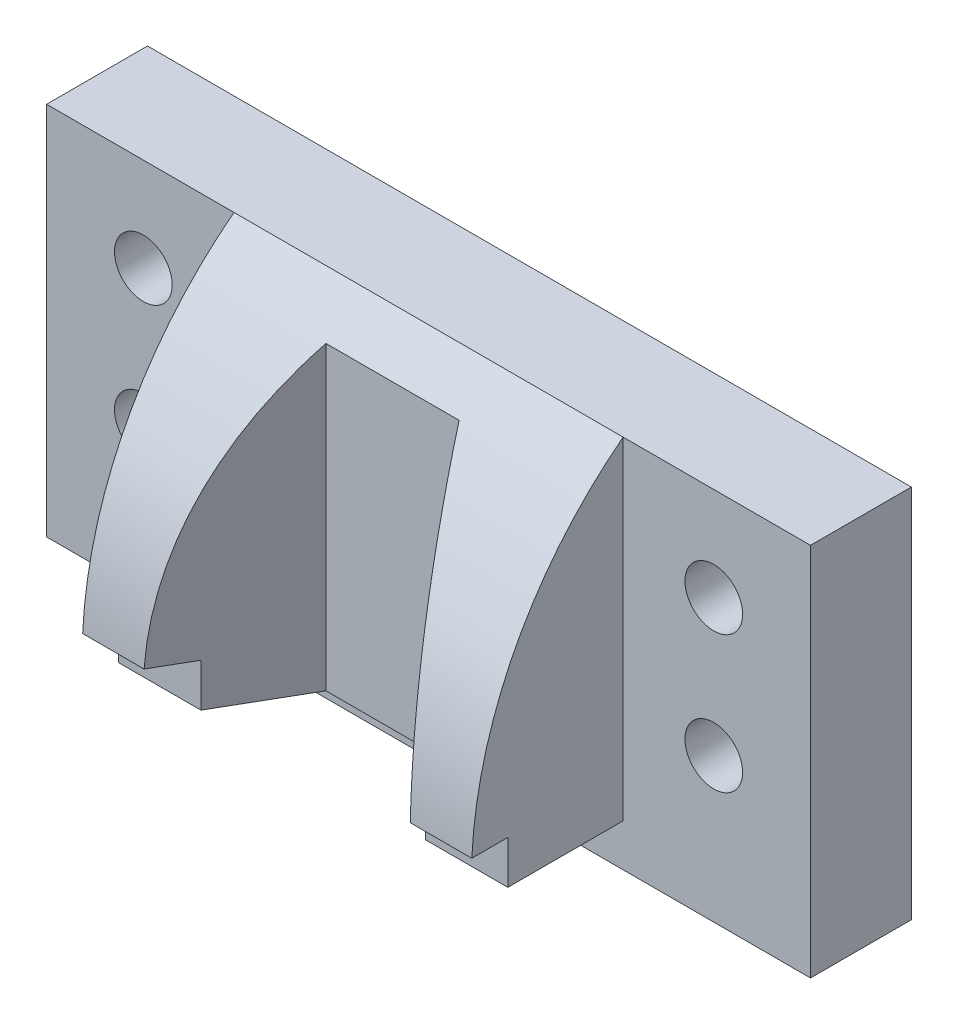
ISO-10303-21;
HEADER;
FILE_DESCRIPTION(('STEP AP214'),'2;1');
FILE_NAME('part.step','',(''),(''),'','','');
FILE_SCHEMA(('AUTOMOTIVE_DESIGN { 1 0 10303 214 1 1 1 1 }'));
ENDSEC;
DATA;
#1=APPLICATION_CONTEXT('core data for automotive mechanical design processes');
#2=APPLICATION_PROTOCOL_DEFINITION('international standard','automotive_design',2000,#1);
#3=PRODUCT_CONTEXT('',#1,'mechanical');
#4=PRODUCT('Part','Part','',(#3));
#5=PRODUCT_RELATED_PRODUCT_CATEGORY('part','',(#4));
#6=PRODUCT_DEFINITION_FORMATION('','',#4);
#7=PRODUCT_DEFINITION_CONTEXT('part definition',#1,'design');
#8=PRODUCT_DEFINITION('design','',#6,#7);
#9=PRODUCT_DEFINITION_SHAPE('','',#8);
#10=(LENGTH_UNIT() NAMED_UNIT(*) SI_UNIT(.MILLI.,.METRE.));
#11=(NAMED_UNIT(*) PLANE_ANGLE_UNIT() SI_UNIT($,.RADIAN.));
#12=(NAMED_UNIT(*) SI_UNIT($,.STERADIAN.) SOLID_ANGLE_UNIT());
#13=UNCERTAINTY_MEASURE_WITH_UNIT(LENGTH_MEASURE(1.E-05),#10,'distance_accuracy_value','');
#14=(GEOMETRIC_REPRESENTATION_CONTEXT(3) GLOBAL_UNCERTAINTY_ASSIGNED_CONTEXT((#13)) GLOBAL_UNIT_ASSIGNED_CONTEXT((#10,
#11,#12)) REPRESENTATION_CONTEXT('',''));
#15=CARTESIAN_POINT('',(0.,0.,0.));
#16=DIRECTION('',(0.,0.,1.));
#17=DIRECTION('',(1.,0.,0.));
#18=AXIS2_PLACEMENT_3D('',#15,#16,#17);
#19=CARTESIAN_POINT('',(-27.,-20.1088526123672,30.));
#20=DIRECTION('',(0.,0.,-1.));
#21=DIRECTION('',(-1.,0.,0.));
#22=AXIS2_PLACEMENT_3D('',#19,#20,#21);
#23=PLANE('',#22);
#24=DIRECTION('',(1.,0.,0.));
#25=VECTOR('',#24,1.);
#26=CARTESIAN_POINT('',(-27.,-20.1088526123672,30.));
#27=LINE('',#26,#25);
#28=CARTESIAN_POINT('',(-27.,-20.1088526123672,30.));
#29=VERTEX_POINT('',#28);
#30=CARTESIAN_POINT('',(-15.5884572681199,-20.1088526123672,30.));
#31=VERTEX_POINT('',#30);
#32=EDGE_CURVE('E236',#29,#31,#27,.T.);
#33=ORIENTED_EDGE('',*,*,#32,.T.);
#34=DIRECTION('',(0.,1.,0.));
#35=VECTOR('',#34,1.);
#36=CARTESIAN_POINT('',(-15.5884572681199,-20.1088526123672,30.));
#37=LINE('',#36,#35);
#38=CARTESIAN_POINT('',(-15.5884572681199,-14.1088526123672,30.));
#39=VERTEX_POINT('',#38);
#40=EDGE_CURVE('E181',#31,#39,#37,.T.);
#41=ORIENTED_EDGE('',*,*,#40,.T.);
#42=DIRECTION('',(1.,0.,0.));
#43=VECTOR('',#42,1.);
#44=CARTESIAN_POINT('',(-27.,-14.1088526123672,30.));
#45=LINE('',#44,#43);
#46=CARTESIAN_POINT('',(-27.,-14.1088526123672,30.));
#47=VERTEX_POINT('',#46);
#48=EDGE_CURVE('E232',#47,#39,#45,.T.);
#49=ORIENTED_EDGE('',*,*,#48,.F.);
#50=DIRECTION('',(0.,1.,0.));
#51=VECTOR('',#50,1.);
#52=CARTESIAN_POINT('',(-27.,-20.1088526123672,30.));
#53=LINE('',#52,#51);
#54=EDGE_CURVE('E205',#29,#47,#53,.T.);
#55=ORIENTED_EDGE('',*,*,#54,.F.);
#56=EDGE_LOOP('',(#33,#41,#49,#55));
#57=FACE_BOUND('',#56,.T.);
#58=ADVANCED_FACE('F43',(#57),#23,.F.);
#59=CARTESIAN_POINT('',(-27.,-14.1088526123672,30.));
#60=DIRECTION('',(0.,1.,0.));
#61=DIRECTION('',(-1.,0.,0.));
#62=AXIS2_PLACEMENT_3D('',#59,#60,#61);
#63=PLANE('',#62);
#64=ORIENTED_EDGE('',*,*,#48,.T.);
#65=DIRECTION('',(-0.500000000000001,0.,0.866025403784438));
#66=VECTOR('',#65,1.);
#67=CARTESIAN_POINT('',(-18.4413429510899,-14.1088526123672,34.9413429510899));
#68=LINE('',#67,#66);
#69=CARTESIAN_POINT('',(-18.475208614068,-14.1088526123672,35.));
#70=VERTEX_POINT('',#69);
#71=EDGE_CURVE('E11',#39,#70,#68,.T.);
#72=ORIENTED_EDGE('',*,*,#71,.T.);
#73=DIRECTION('',(1.,0.,0.));
#74=VECTOR('',#73,1.);
#75=CARTESIAN_POINT('',(-27.,-14.1088526123672,35.));
#76=LINE('',#75,#74);
#77=CARTESIAN_POINT('',(-27.,-14.1088526123672,35.));
#78=VERTEX_POINT('',#77);
#79=EDGE_CURVE('E227',#78,#70,#76,.T.);
#80=ORIENTED_EDGE('',*,*,#79,.F.);
#81=DIRECTION('',(0.,0.,1.));
#82=VECTOR('',#81,1.);
#83=CARTESIAN_POINT('',(-27.,-14.1088526123672,30.));
#84=LINE('',#83,#82);
#85=EDGE_CURVE('E208',#47,#78,#84,.T.);
#86=ORIENTED_EDGE('',*,*,#85,.F.);
#87=EDGE_LOOP('',(#64,#72,#80,#86));
#88=FACE_BOUND('',#87,.T.);
#89=ADVANCED_FACE('F378',(#88),#63,.F.);
#90=CARTESIAN_POINT('',(0.,0.,14.));
#91=DIRECTION('',(0.,0.,1.));
#92=DIRECTION('',(1.,0.,0.));
#93=AXIS2_PLACEMENT_3D('',#90,#91,#92);
#94=PLANE('',#93);
#95=CARTESIAN_POINT('',(-39.57642042842,13.,14.));
#96=DIRECTION('',(0.,0.,-1.));
#97=DIRECTION('',(-1.,0.,0.));
#98=AXIS2_PLACEMENT_3D('',#95,#96,#97);
#99=CIRCLE('',#98,4.00000000000001);
#100=CARTESIAN_POINT('',(-43.57642042842,13.,14.));
#101=VERTEX_POINT('',#100);
#102=EDGE_CURVE('E252',#101,#101,#99,.T.);
#103=ORIENTED_EDGE('',*,*,#102,.T.);
#104=EDGE_LOOP('',(#103));
#105=FACE_BOUND('',#104,.T.);
#106=CARTESIAN_POINT('',(-39.57642042842,-6.00000000000002,14.));
#107=DIRECTION('',(0.,0.,-1.));
#108=DIRECTION('',(-1.,0.,0.));
#109=AXIS2_PLACEMENT_3D('',#106,#107,#108);
#110=CIRCLE('',#109,4.00000000000001);
#111=CARTESIAN_POINT('',(-43.57642042842,-6.00000000000002,14.));
#112=VERTEX_POINT('',#111);
#113=EDGE_CURVE('E246',#112,#112,#110,.T.);
#114=ORIENTED_EDGE('',*,*,#113,.T.);
#115=EDGE_LOOP('',(#114));
#116=FACE_BOUND('',#115,.T.);
#117=CARTESIAN_POINT('',(39.57642042842,13.,14.));
#118=DIRECTION('',(0.,0.,1.));
#119=DIRECTION('',(1.,0.,0.));
#120=AXIS2_PLACEMENT_3D('',#117,#118,#119);
#121=CIRCLE('',#120,4.00000000000001);
#122=CARTESIAN_POINT('',(43.57642042842,13.,14.));
#123=VERTEX_POINT('',#122);
#124=EDGE_CURVE('E268',#123,#123,#121,.T.);
#125=ORIENTED_EDGE('',*,*,#124,.F.);
#126=EDGE_LOOP('',(#125));
#127=FACE_BOUND('',#126,.T.);
#128=CARTESIAN_POINT('',(39.57642042842,-6.,14.));
#129=DIRECTION('',(0.,0.,1.));
#130=DIRECTION('',(1.,0.,0.));
#131=AXIS2_PLACEMENT_3D('',#128,#129,#130);
#132=CIRCLE('',#131,4.00000000000001);
#133=CARTESIAN_POINT('',(43.57642042842,-6.,14.));
#134=VERTEX_POINT('',#133);
#135=EDGE_CURVE('E272',#134,#134,#132,.T.);
#136=ORIENTED_EDGE('',*,*,#135,.F.);
#137=EDGE_LOOP('',(#136));
#138=FACE_BOUND('',#137,.T.);
#139=DIRECTION('',(-1.,0.,0.));
#140=VECTOR('',#139,1.);
#141=CARTESIAN_POINT('',(-53.,26.,14.));
#142=LINE('',#141,#140);
#143=CARTESIAN_POINT('',(53.,26.,14.));
#144=VERTEX_POINT('',#143);
#145=CARTESIAN_POINT('',(27.,26.,14.));
#146=VERTEX_POINT('',#145);
#147=EDGE_CURVE('E285',#144,#146,#142,.T.);
#148=ORIENTED_EDGE('',*,*,#147,.T.);
#149=DIRECTION('',(0.,-1.,0.));
#150=VECTOR('',#149,1.);
#151=CARTESIAN_POINT('',(27.,26.,14.));
#152=LINE('',#151,#150);
#153=CARTESIAN_POINT('',(27.,-20.1088526123672,14.));
#154=VERTEX_POINT('',#153);
#155=EDGE_CURVE('E67',#146,#154,#152,.T.);
#156=ORIENTED_EDGE('',*,*,#155,.T.);
#157=DIRECTION('',(1.,0.,0.));
#158=VECTOR('',#157,1.);
#159=CARTESIAN_POINT('',(-27.,-20.1088526123672,14.));
#160=LINE('',#159,#158);
#161=CARTESIAN_POINT('',(-27.,-20.1088526123672,14.));
#162=VERTEX_POINT('',#161);
#163=EDGE_CURVE('E240',#162,#154,#160,.T.);
#164=ORIENTED_EDGE('',*,*,#163,.F.);
#165=DIRECTION('',(0.,-1.,0.));
#166=VECTOR('',#165,1.);
#167=CARTESIAN_POINT('',(-27.,26.,14.));
#168=LINE('',#167,#166);
#169=CARTESIAN_POINT('',(-27.,26.,14.));
#170=VERTEX_POINT('',#169);
#171=EDGE_CURVE('E197',#170,#162,#168,.T.);
#172=ORIENTED_EDGE('',*,*,#171,.F.);
#173=CARTESIAN_POINT('',(-53.,26.,14.));
#174=VERTEX_POINT('',#173);
#175=EDGE_CURVE('E283',#170,#174,#142,.T.);
#176=ORIENTED_EDGE('',*,*,#175,.T.);
#177=DIRECTION('',(0.,-1.,0.));
#178=VECTOR('',#177,1.);
#179=CARTESIAN_POINT('',(-53.,26.,14.));
#180=LINE('',#179,#178);
#181=CARTESIAN_POINT('',(-53.,-26.,14.));
#182=VERTEX_POINT('',#181);
#183=EDGE_CURVE('E288',#174,#182,#180,.T.);
#184=ORIENTED_EDGE('',*,*,#183,.T.);
#185=DIRECTION('',(1.,0.,0.));
#186=VECTOR('',#185,1.);
#187=CARTESIAN_POINT('',(-53.,-26.,14.));
#188=LINE('',#187,#186);
#189=CARTESIAN_POINT('',(53.,-26.,14.));
#190=VERTEX_POINT('',#189);
#191=EDGE_CURVE('E291',#182,#190,#188,.T.);
#192=ORIENTED_EDGE('',*,*,#191,.T.);
#193=DIRECTION('',(0.,1.,0.));
#194=VECTOR('',#193,1.);
#195=CARTESIAN_POINT('',(53.,26.,14.));
#196=LINE('',#195,#194);
#197=EDGE_CURVE('E279',#190,#144,#196,.T.);
#198=ORIENTED_EDGE('',*,*,#197,.T.);
#199=EDGE_LOOP('',(#148,#156,#164,#172,#176,#184,#192,#198));
#200=FACE_BOUND('',#199,.T.);
#201=ADVANCED_FACE('F341',(#105,#116,#127,#138,#200),#94,.T.);
#202=CARTESIAN_POINT('',(53.,26.,14.));
#203=DIRECTION('',(-1.,0.,0.));
#204=DIRECTION('',(0.,-1.,0.));
#205=AXIS2_PLACEMENT_3D('',#202,#203,#204);
#206=PLANE('',#205);
#207=DIRECTION('',(0.,1.,0.));
#208=VECTOR('',#207,1.);
#209=CARTESIAN_POINT('',(53.,26.,0.));
#210=LINE('',#209,#208);
#211=CARTESIAN_POINT('',(53.,-26.,0.));
#212=VERTEX_POINT('',#211);
#213=CARTESIAN_POINT('',(53.,26.,0.));
#214=VERTEX_POINT('',#213);
#215=EDGE_CURVE('E267',#212,#214,#210,.T.);
#216=ORIENTED_EDGE('',*,*,#215,.T.);
#217=DIRECTION('',(0.,0.,-1.));
#218=VECTOR('',#217,1.);
#219=CARTESIAN_POINT('',(53.,26.,14.));
#220=LINE('',#219,#218);
#221=EDGE_CURVE('E317',#144,#214,#220,.T.);
#222=ORIENTED_EDGE('',*,*,#221,.F.);
#223=ORIENTED_EDGE('',*,*,#197,.F.);
#224=DIRECTION('',(0.,0.,-1.));
#225=VECTOR('',#224,1.);
#226=CARTESIAN_POINT('',(53.,-26.,14.));
#227=LINE('',#226,#225);
#228=EDGE_CURVE('E294',#190,#212,#227,.T.);
#229=ORIENTED_EDGE('',*,*,#228,.T.);
#230=EDGE_LOOP('',(#216,#222,#223,#229));
#231=FACE_BOUND('',#230,.T.);
#232=ADVANCED_FACE('F45',(#231),#206,.F.);
#233=CARTESIAN_POINT('',(-53.,26.,14.));
#234=DIRECTION('',(0.,-1.,0.));
#235=DIRECTION('',(0.,0.,-1.));
#236=AXIS2_PLACEMENT_3D('',#233,#234,#235);
#237=PLANE('',#236);
#238=DIRECTION('',(-1.,0.,0.));
#239=VECTOR('',#238,1.);
#240=CARTESIAN_POINT('',(-53.,26.,0.));
#241=LINE('',#240,#239);
#242=CARTESIAN_POINT('',(-53.,26.,0.));
#243=VERTEX_POINT('',#242);
#244=EDGE_CURVE('E298',#214,#243,#241,.T.);
#245=ORIENTED_EDGE('',*,*,#244,.T.);
#246=DIRECTION('',(0.,0.,-1.));
#247=VECTOR('',#246,1.);
#248=CARTESIAN_POINT('',(-53.,26.,14.));
#249=LINE('',#248,#247);
#250=EDGE_CURVE('E313',#174,#243,#249,.T.);
#251=ORIENTED_EDGE('',*,*,#250,.F.);
#252=ORIENTED_EDGE('',*,*,#175,.F.);
#253=DIRECTION('',(1.,0.,0.));
#254=VECTOR('',#253,1.);
#255=CARTESIAN_POINT('',(-27.,26.,14.));
#256=LINE('',#255,#254);
#257=EDGE_CURVE('E243',#170,#146,#256,.T.);
#258=ORIENTED_EDGE('',*,*,#257,.T.);
#259=ORIENTED_EDGE('',*,*,#147,.F.);
#260=ORIENTED_EDGE('',*,*,#221,.T.);
#261=EDGE_LOOP('',(#245,#251,#252,#258,#259,#260));
#262=FACE_BOUND('',#261,.T.);
#263=ADVANCED_FACE('F349',(#262),#237,.F.);
#264=CARTESIAN_POINT('',(-53.,26.,14.));
#265=DIRECTION('',(1.,0.,0.));
#266=DIRECTION('',(0.,1.,0.));
#267=AXIS2_PLACEMENT_3D('',#264,#265,#266);
#268=PLANE('',#267);
#269=DIRECTION('',(0.,-1.,0.));
#270=VECTOR('',#269,1.);
#271=CARTESIAN_POINT('',(-53.,26.,0.));
#272=LINE('',#271,#270);
#273=CARTESIAN_POINT('',(-53.,-26.,0.));
#274=VERTEX_POINT('',#273);
#275=EDGE_CURVE('E301',#243,#274,#272,.T.);
#276=ORIENTED_EDGE('',*,*,#275,.T.);
#277=DIRECTION('',(0.,0.,-1.));
#278=VECTOR('',#277,1.);
#279=CARTESIAN_POINT('',(-53.,-26.,14.));
#280=LINE('',#279,#278);
#281=EDGE_CURVE('E309',#182,#274,#280,.T.);
#282=ORIENTED_EDGE('',*,*,#281,.F.);
#283=ORIENTED_EDGE('',*,*,#183,.F.);
#284=ORIENTED_EDGE('',*,*,#250,.T.);
#285=EDGE_LOOP('',(#276,#282,#283,#284));
#286=FACE_BOUND('',#285,.T.);
#287=ADVANCED_FACE('F361',(#286),#268,.F.);
#288=CARTESIAN_POINT('',(-53.,-26.,14.));
#289=DIRECTION('',(0.,1.,0.));
#290=DIRECTION('',(0.,0.,1.));
#291=AXIS2_PLACEMENT_3D('',#288,#289,#290);
#292=PLANE('',#291);
#293=DIRECTION('',(1.,0.,0.));
#294=VECTOR('',#293,1.);
#295=CARTESIAN_POINT('',(-53.,-26.,0.));
#296=LINE('',#295,#294);
#297=EDGE_CURVE('E284',#274,#212,#296,.T.);
#298=ORIENTED_EDGE('',*,*,#297,.T.);
#299=ORIENTED_EDGE('',*,*,#228,.F.);
#300=ORIENTED_EDGE('',*,*,#191,.F.);
#301=ORIENTED_EDGE('',*,*,#281,.T.);
#302=EDGE_LOOP('',(#298,#299,#300,#301));
#303=FACE_BOUND('',#302,.T.);
#304=ADVANCED_FACE('F366',(#303),#292,.F.);
#305=CARTESIAN_POINT('',(0.,0.,0.));
#306=DIRECTION('',(0.,0.,1.));
#307=DIRECTION('',(1.,0.,0.));
#308=AXIS2_PLACEMENT_3D('',#305,#306,#307);
#309=PLANE('',#308);
#310=CARTESIAN_POINT('',(-39.57642042842,13.,0.));
#311=DIRECTION('',(0.,0.,-1.));
#312=DIRECTION('',(-1.,0.,0.));
#313=AXIS2_PLACEMENT_3D('',#310,#311,#312);
#314=CIRCLE('',#313,4.00000000000001);
#315=CARTESIAN_POINT('',(-43.57642042842,13.,0.));
#316=VERTEX_POINT('',#315);
#317=EDGE_CURVE('E247',#316,#316,#314,.T.);
#318=ORIENTED_EDGE('',*,*,#317,.F.);
#319=EDGE_LOOP('',(#318));
#320=FACE_BOUND('',#319,.T.);
#321=CARTESIAN_POINT('',(-39.57642042842,-6.00000000000002,0.));
#322=DIRECTION('',(0.,0.,-1.));
#323=DIRECTION('',(-1.,0.,0.));
#324=AXIS2_PLACEMENT_3D('',#321,#322,#323);
#325=CIRCLE('',#324,4.00000000000001);
#326=CARTESIAN_POINT('',(-43.57642042842,-6.00000000000002,0.));
#327=VERTEX_POINT('',#326);
#328=EDGE_CURVE('E256',#327,#327,#325,.T.);
#329=ORIENTED_EDGE('',*,*,#328,.F.);
#330=EDGE_LOOP('',(#329));
#331=FACE_BOUND('',#330,.T.);
#332=CARTESIAN_POINT('',(39.57642042842,13.,0.));
#333=DIRECTION('',(0.,0.,1.));
#334=DIRECTION('',(1.,0.,0.));
#335=AXIS2_PLACEMENT_3D('',#332,#333,#334);
#336=CIRCLE('',#335,4.00000000000001);
#337=CARTESIAN_POINT('',(43.57642042842,13.,0.));
#338=VERTEX_POINT('',#337);
#339=EDGE_CURVE('E263',#338,#338,#336,.T.);
#340=ORIENTED_EDGE('',*,*,#339,.T.);
#341=EDGE_LOOP('',(#340));
#342=FACE_BOUND('',#341,.T.);
#343=CARTESIAN_POINT('',(39.57642042842,-6.,0.));
#344=DIRECTION('',(0.,0.,1.));
#345=DIRECTION('',(1.,0.,0.));
#346=AXIS2_PLACEMENT_3D('',#343,#344,#345);
#347=CIRCLE('',#346,4.00000000000001);
#348=CARTESIAN_POINT('',(43.57642042842,-6.,0.));
#349=VERTEX_POINT('',#348);
#350=EDGE_CURVE('E251',#349,#349,#347,.T.);
#351=ORIENTED_EDGE('',*,*,#350,.T.);
#352=EDGE_LOOP('',(#351));
#353=FACE_BOUND('',#352,.T.);
#354=ORIENTED_EDGE('',*,*,#215,.F.);
#355=ORIENTED_EDGE('',*,*,#297,.F.);
#356=ORIENTED_EDGE('',*,*,#275,.F.);
#357=ORIENTED_EDGE('',*,*,#244,.F.);
#358=EDGE_LOOP('',(#354,#355,#356,#357));
#359=FACE_BOUND('',#358,.T.);
#360=ADVANCED_FACE('F364',(#320,#331,#342,#353,#359),#309,.F.);
#361=CARTESIAN_POINT('',(39.57642042842,-6.,0.));
#362=DIRECTION('',(0.,0.,1.));
#363=DIRECTION('',(1.,0.,0.));
#364=AXIS2_PLACEMENT_3D('',#361,#362,#363);
#365=CYLINDRICAL_SURFACE('',#364,4.00000000000001);
#366=ORIENTED_EDGE('',*,*,#350,.F.);
#367=EDGE_LOOP('',(#366));
#368=FACE_BOUND('',#367,.T.);
#369=ORIENTED_EDGE('',*,*,#135,.T.);
#370=EDGE_LOOP('',(#369));
#371=FACE_BOUND('',#370,.T.);
#372=ADVANCED_FACE('F373',(#368,#371),#365,.F.);
#373=CARTESIAN_POINT('',(39.57642042842,13.,0.));
#374=DIRECTION('',(0.,0.,1.));
#375=DIRECTION('',(1.,0.,0.));
#376=AXIS2_PLACEMENT_3D('',#373,#374,#375);
#377=CYLINDRICAL_SURFACE('',#376,4.00000000000001);
#378=ORIENTED_EDGE('',*,*,#339,.F.);
#379=EDGE_LOOP('',(#378));
#380=FACE_BOUND('',#379,.T.);
#381=ORIENTED_EDGE('',*,*,#124,.T.);
#382=EDGE_LOOP('',(#381));
#383=FACE_BOUND('',#382,.T.);
#384=ADVANCED_FACE('F404',(#380,#383),#377,.F.);
#385=CARTESIAN_POINT('',(-39.57642042842,-6.00000000000002,0.));
#386=DIRECTION('',(0.,0.,1.));
#387=DIRECTION('',(1.,0.,0.));
#388=AXIS2_PLACEMENT_3D('',#385,#386,#387);
#389=CYLINDRICAL_SURFACE('',#388,4.00000000000001);
#390=ORIENTED_EDGE('',*,*,#328,.T.);
#391=EDGE_LOOP('',(#390));
#392=FACE_BOUND('',#391,.T.);
#393=ORIENTED_EDGE('',*,*,#113,.F.);
#394=EDGE_LOOP('',(#393));
#395=FACE_BOUND('',#394,.T.);
#396=ADVANCED_FACE('F400',(#392,#395),#389,.F.);
#397=CARTESIAN_POINT('',(-39.57642042842,13.,0.));
#398=DIRECTION('',(0.,0.,1.));
#399=DIRECTION('',(1.,0.,0.));
#400=AXIS2_PLACEMENT_3D('',#397,#398,#399);
#401=CYLINDRICAL_SURFACE('',#400,4.00000000000001);
#402=ORIENTED_EDGE('',*,*,#317,.T.);
#403=EDGE_LOOP('',(#402));
#404=FACE_BOUND('',#403,.T.);
#405=ORIENTED_EDGE('',*,*,#102,.F.);
#406=EDGE_LOOP('',(#405));
#407=FACE_BOUND('',#406,.T.);
#408=ADVANCED_FACE('F395',(#404,#407),#401,.F.);
#409=CARTESIAN_POINT('',(-27.,-16.7949470377858,-18.9331521120149));
#410=DIRECTION('',(1.,0.,0.));
#411=DIRECTION('',(0.,1.,0.));
#412=AXIS2_PLACEMENT_3D('',#409,#410,#411);
#413=CYLINDRICAL_SURFACE('',#412,54.);
#414=ORIENTED_EDGE('',*,*,#79,.T.);
#415=CARTESIAN_POINT('',(12.6631112760489,-16.7949470377858,-18.9331521120149));
#416=DIRECTION('',(-0.866025403784438,0.,-0.500000000000001));
#417=DIRECTION('',(0.500000000000001,0.,-0.866025403784438));
#418=AXIS2_PLACEMENT_3D('',#415,#416,#417);
#419=ELLIPSE('',#418,62.3538290724796,54.);
#420=CARTESIAN_POINT('',(-9.237604307034,21.6377990369711,19.));
#421=VERTEX_POINT('',#420);
#422=EDGE_CURVE('E185',#70,#421,#419,.T.);
#423=ORIENTED_EDGE('',*,*,#422,.T.);
#424=DIRECTION('',(1.,0.,0.));
#425=VECTOR('',#424,1.);
#426=CARTESIAN_POINT('',(-27.,21.6377990369711,19.));
#427=LINE('',#426,#425);
#428=CARTESIAN_POINT('',(9.23760430703399,21.6377990369711,19.));
#429=VERTEX_POINT('',#428);
#430=EDGE_CURVE('E189',#421,#429,#427,.T.);
#431=ORIENTED_EDGE('',*,*,#430,.T.);
#432=CARTESIAN_POINT('',(-12.6631112760489,-16.7949470377858,-18.9331521120149));
#433=DIRECTION('',(0.866025403784438,0.,-0.500000000000001));
#434=DIRECTION('',(0.500000000000001,0.,0.866025403784438));
#435=AXIS2_PLACEMENT_3D('',#432,#433,#434);
#436=ELLIPSE('',#435,62.3538290724796,54.);
#437=CARTESIAN_POINT('',(18.475208614068,-14.1088526123672,35.));
#438=VERTEX_POINT('',#437);
#439=EDGE_CURVE('E150',#429,#438,#436,.T.);
#440=ORIENTED_EDGE('',*,*,#439,.T.);
#441=CARTESIAN_POINT('',(27.,-14.1088526123672,35.));
#442=VERTEX_POINT('',#441);
#443=EDGE_CURVE('E211',#438,#442,#76,.T.);
#444=ORIENTED_EDGE('',*,*,#443,.T.);
#445=CARTESIAN_POINT('',(27.,-16.7949470377858,-18.9331521120149));
#446=DIRECTION('',(-1.,0.,0.));
#447=DIRECTION('',(0.,1.,0.));
#448=AXIS2_PLACEMENT_3D('',#445,#446,#447);
#449=CIRCLE('',#448,54.);
#450=EDGE_CURVE('E192',#442,#146,#449,.T.);
#451=ORIENTED_EDGE('',*,*,#450,.T.);
#452=ORIENTED_EDGE('',*,*,#257,.F.);
#453=CARTESIAN_POINT('',(-27.,-16.7949470377858,-18.9331521120149));
#454=DIRECTION('',(-1.,0.,0.));
#455=DIRECTION('',(0.,1.,0.));
#456=AXIS2_PLACEMENT_3D('',#453,#454,#455);
#457=CIRCLE('',#456,54.);
#458=EDGE_CURVE('E193',#78,#170,#457,.T.);
#459=ORIENTED_EDGE('',*,*,#458,.F.);
#460=EDGE_LOOP('',(#414,#423,#431,#440,#444,#451,#452,#459));
#461=FACE_BOUND('',#460,.T.);
#462=ADVANCED_FACE('F333',(#461),#413,.T.);
#463=CARTESIAN_POINT('',(-27.,-20.1088526123672,14.));
#464=DIRECTION('',(0.,1.,0.));
#465=DIRECTION('',(-1.,0.,0.));
#466=AXIS2_PLACEMENT_3D('',#463,#464,#465);
#467=PLANE('',#466);
#468=DIRECTION('',(1.,0.,0.));
#469=VECTOR('',#468,1.);
#470=CARTESIAN_POINT('',(-9.237604307034,-20.1088526123672,19.));
#471=LINE('',#470,#469);
#472=CARTESIAN_POINT('',(-9.237604307034,-20.1088526123672,19.));
#473=VERTEX_POINT('',#472);
#474=CARTESIAN_POINT('',(9.237604307034,-20.1088526123672,19.));
#475=VERTEX_POINT('',#474);
#476=EDGE_CURVE('E158',#473,#475,#471,.T.);
#477=ORIENTED_EDGE('',*,*,#476,.F.);
#478=DIRECTION('',(0.500000000000001,0.,-0.866025403784438));
#479=VECTOR('',#478,1.);
#480=CARTESIAN_POINT('',(-9.237604307034,-20.1088526123672,19.));
#481=LINE('',#480,#479);
#482=EDGE_CURVE('E155',#31,#473,#481,.T.);
#483=ORIENTED_EDGE('',*,*,#482,.F.);
#484=ORIENTED_EDGE('',*,*,#32,.F.);
#485=DIRECTION('',(0.,0.,1.));
#486=VECTOR('',#485,1.);
#487=CARTESIAN_POINT('',(-27.,-20.1088526123672,14.));
#488=LINE('',#487,#486);
#489=EDGE_CURVE('E202',#162,#29,#488,.T.);
#490=ORIENTED_EDGE('',*,*,#489,.F.);
#491=ORIENTED_EDGE('',*,*,#163,.T.);
#492=DIRECTION('',(0.,0.,1.));
#493=VECTOR('',#492,1.);
#494=CARTESIAN_POINT('',(27.,-20.1088526123672,14.));
#495=LINE('',#494,#493);
#496=CARTESIAN_POINT('',(27.,-20.1088526123672,30.));
#497=VERTEX_POINT('',#496);
#498=EDGE_CURVE('E217',#154,#497,#495,.T.);
#499=ORIENTED_EDGE('',*,*,#498,.T.);
#500=CARTESIAN_POINT('',(15.5884572681199,-20.1088526123672,30.));
#501=VERTEX_POINT('',#500);
#502=EDGE_CURVE('E169',#501,#497,#27,.T.);
#503=ORIENTED_EDGE('',*,*,#502,.F.);
#504=DIRECTION('',(0.500000000000001,0.,0.866025403784438));
#505=VECTOR('',#504,1.);
#506=CARTESIAN_POINT('',(9.237604307034,-20.1088526123672,19.));
#507=LINE('',#506,#505);
#508=EDGE_CURVE('E148',#475,#501,#507,.T.);
#509=ORIENTED_EDGE('',*,*,#508,.F.);
#510=EDGE_LOOP('',(#477,#483,#484,#490,#491,#499,#503,#509));
#511=FACE_BOUND('',#510,.T.);
#512=ADVANCED_FACE('F167',(#511),#467,.F.);
#513=CARTESIAN_POINT('',(15.5884572681199,-14.1088526123672,30.));
#514=VERTEX_POINT('',#513);
#515=CARTESIAN_POINT('',(27.,-14.1088526123672,30.));
#516=VERTEX_POINT('',#515);
#517=EDGE_CURVE('E231',#514,#516,#45,.T.);
#518=ORIENTED_EDGE('',*,*,#517,.F.);
#519=DIRECTION('',(0.,-1.,0.));
#520=VECTOR('',#519,1.);
#521=CARTESIAN_POINT('',(15.5884572681199,-20.1088526123672,30.));
#522=LINE('',#521,#520);
#523=EDGE_CURVE('E59',#514,#501,#522,.T.);
#524=ORIENTED_EDGE('',*,*,#523,.T.);
#525=ORIENTED_EDGE('',*,*,#502,.T.);
#526=DIRECTION('',(0.,1.,0.));
#527=VECTOR('',#526,1.);
#528=CARTESIAN_POINT('',(27.,-20.1088526123672,30.));
#529=LINE('',#528,#527);
#530=EDGE_CURVE('E220',#497,#516,#529,.T.);
#531=ORIENTED_EDGE('',*,*,#530,.T.);
#532=EDGE_LOOP('',(#518,#524,#525,#531));
#533=FACE_BOUND('',#532,.T.);
#534=ADVANCED_FACE('F326',(#533),#23,.F.);
#535=ORIENTED_EDGE('',*,*,#443,.F.);
#536=DIRECTION('',(-0.500000000000001,0.,-0.866025403784438));
#537=VECTOR('',#536,1.);
#538=CARTESIAN_POINT('',(4.94134295108987,-14.1088526123672,11.55865704891));
#539=LINE('',#538,#537);
#540=EDGE_CURVE('E52',#438,#514,#539,.T.);
#541=ORIENTED_EDGE('',*,*,#540,.T.);
#542=ORIENTED_EDGE('',*,*,#517,.T.);
#543=DIRECTION('',(0.,0.,1.));
#544=VECTOR('',#543,1.);
#545=CARTESIAN_POINT('',(27.,-14.1088526123672,30.));
#546=LINE('',#545,#544);
#547=EDGE_CURVE('E198',#516,#442,#546,.T.);
#548=ORIENTED_EDGE('',*,*,#547,.T.);
#549=EDGE_LOOP('',(#535,#541,#542,#548));
#550=FACE_BOUND('',#549,.T.);
#551=ADVANCED_FACE('F324',(#550),#63,.F.);
#552=CARTESIAN_POINT('',(-27.,-16.7949470377858,-18.9331521120149));
#553=DIRECTION('',(1.,0.,0.));
#554=DIRECTION('',(0.,1.,0.));
#555=AXIS2_PLACEMENT_3D('',#552,#553,#554);
#556=PLANE('',#555);
#557=ORIENTED_EDGE('',*,*,#458,.T.);
#558=ORIENTED_EDGE('',*,*,#171,.T.);
#559=ORIENTED_EDGE('',*,*,#489,.T.);
#560=ORIENTED_EDGE('',*,*,#54,.T.);
#561=ORIENTED_EDGE('',*,*,#85,.T.);
#562=EDGE_LOOP('',(#557,#558,#559,#560,#561));
#563=FACE_BOUND('',#562,.T.);
#564=ADVANCED_FACE('F344',(#563),#556,.F.);
#565=CARTESIAN_POINT('',(27.,-16.7949470377858,-18.9331521120149));
#566=DIRECTION('',(1.,0.,0.));
#567=DIRECTION('',(0.,1.,0.));
#568=AXIS2_PLACEMENT_3D('',#565,#566,#567);
#569=PLANE('',#568);
#570=ORIENTED_EDGE('',*,*,#450,.F.);
#571=ORIENTED_EDGE('',*,*,#547,.F.);
#572=ORIENTED_EDGE('',*,*,#530,.F.);
#573=ORIENTED_EDGE('',*,*,#498,.F.);
#574=ORIENTED_EDGE('',*,*,#155,.F.);
#575=EDGE_LOOP('',(#570,#571,#572,#573,#574));
#576=FACE_BOUND('',#575,.T.);
#577=ADVANCED_FACE('F337',(#576),#569,.T.);
#578=CARTESIAN_POINT('',(-9.23760430703401,26.,19.));
#579=DIRECTION('',(0.,0.,-1.));
#580=DIRECTION('',(-1.,0.,0.));
#581=AXIS2_PLACEMENT_3D('',#578,#579,#580);
#582=PLANE('',#581);
#583=DIRECTION('',(0.,-1.,0.));
#584=VECTOR('',#583,1.);
#585=CARTESIAN_POINT('',(-9.23760430703401,26.,19.));
#586=LINE('',#585,#584);
#587=EDGE_CURVE('E154',#421,#473,#586,.T.);
#588=ORIENTED_EDGE('',*,*,#587,.T.);
#589=ORIENTED_EDGE('',*,*,#476,.T.);
#590=DIRECTION('',(0.,-1.,0.));
#591=VECTOR('',#590,1.);
#592=CARTESIAN_POINT('',(9.23760430703399,26.,19.));
#593=LINE('',#592,#591);
#594=EDGE_CURVE('E144',#429,#475,#593,.T.);
#595=ORIENTED_EDGE('',*,*,#594,.F.);
#596=ORIENTED_EDGE('',*,*,#430,.F.);
#597=EDGE_LOOP('',(#588,#589,#595,#596));
#598=FACE_BOUND('',#597,.T.);
#599=ADVANCED_FACE('F159',(#598),#582,.F.);
#600=CARTESIAN_POINT('',(-9.23760430703401,26.,19.));
#601=DIRECTION('',(-0.866025403784438,0.,-0.500000000000001));
#602=DIRECTION('',(-0.500000000000001,0.,0.866025403784438));
#603=AXIS2_PLACEMENT_3D('',#600,#601,#602);
#604=PLANE('',#603);
#605=ORIENTED_EDGE('',*,*,#71,.F.);
#606=ORIENTED_EDGE('',*,*,#40,.F.);
#607=ORIENTED_EDGE('',*,*,#482,.T.);
#608=ORIENTED_EDGE('',*,*,#587,.F.);
#609=ORIENTED_EDGE('',*,*,#422,.F.);
#610=EDGE_LOOP('',(#605,#606,#607,#608,#609));
#611=FACE_BOUND('',#610,.T.);
#612=ADVANCED_FACE('F547',(#611),#604,.F.);
#613=CARTESIAN_POINT('',(9.23760430703399,26.,19.));
#614=DIRECTION('',(0.866025403784438,0.,-0.500000000000001));
#615=DIRECTION('',(-0.500000000000001,0.,-0.866025403784438));
#616=AXIS2_PLACEMENT_3D('',#613,#614,#615);
#617=PLANE('',#616);
#618=ORIENTED_EDGE('',*,*,#594,.T.);
#619=ORIENTED_EDGE('',*,*,#508,.T.);
#620=ORIENTED_EDGE('',*,*,#523,.F.);
#621=ORIENTED_EDGE('',*,*,#540,.F.);
#622=ORIENTED_EDGE('',*,*,#439,.F.);
#623=EDGE_LOOP('',(#618,#619,#620,#621,#622));
#624=FACE_BOUND('',#623,.T.);
#625=ADVANCED_FACE('F146',(#624),#617,.F.);
#626=CLOSED_SHELL('',(#58,#89,#201,#232,#263,#287,#304,#360,#372,#384,#396,#408,#462,#512,#534,
#551,#564,#577,#599,#612,#625));
#627=MANIFOLD_SOLID_BREP('B2',#626);
#628=ADVANCED_BREP_SHAPE_REPRESENTATION('',(#18,#627),#14);
#629=SHAPE_DEFINITION_REPRESENTATION(#9,#628);
ENDSEC;
END-ISO-10303-21;
